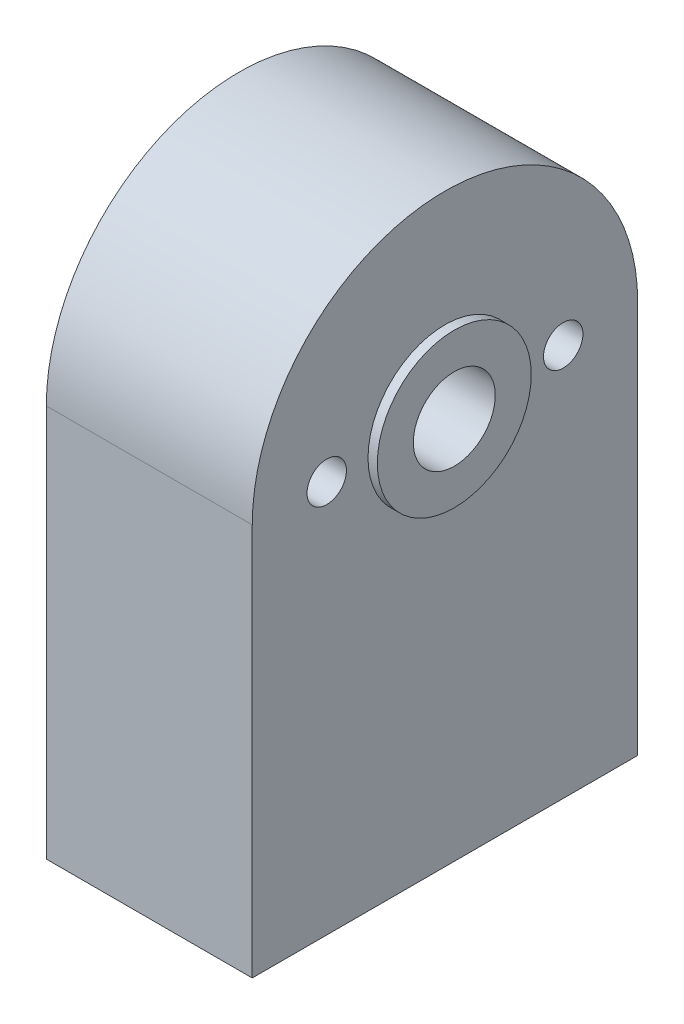
ISO-10303-21;
HEADER;
FILE_DESCRIPTION(('STEP AP214'),'2;1');
FILE_NAME('part.step','',(''),(''),'','','');
FILE_SCHEMA(('AUTOMOTIVE_DESIGN { 1 0 10303 214 1 1 1 1 }'));
ENDSEC;
DATA;
#1=APPLICATION_CONTEXT('core data for automotive mechanical design processes');
#2=APPLICATION_PROTOCOL_DEFINITION('international standard','automotive_design',2000,#1);
#3=PRODUCT_CONTEXT('',#1,'mechanical');
#4=PRODUCT('Part','Part','',(#3));
#5=PRODUCT_RELATED_PRODUCT_CATEGORY('part','',(#4));
#6=PRODUCT_DEFINITION_FORMATION('','',#4);
#7=PRODUCT_DEFINITION_CONTEXT('part definition',#1,'design');
#8=PRODUCT_DEFINITION('design','',#6,#7);
#9=PRODUCT_DEFINITION_SHAPE('','',#8);
#10=(LENGTH_UNIT() NAMED_UNIT(*) SI_UNIT(.MILLI.,.METRE.));
#11=(NAMED_UNIT(*) PLANE_ANGLE_UNIT() SI_UNIT($,.RADIAN.));
#12=(NAMED_UNIT(*) SI_UNIT($,.STERADIAN.) SOLID_ANGLE_UNIT());
#13=UNCERTAINTY_MEASURE_WITH_UNIT(LENGTH_MEASURE(1.E-05),#10,'distance_accuracy_value','');
#14=(GEOMETRIC_REPRESENTATION_CONTEXT(3) GLOBAL_UNCERTAINTY_ASSIGNED_CONTEXT((#13)) GLOBAL_UNIT_ASSIGNED_CONTEXT((#10,
#11,#12)) REPRESENTATION_CONTEXT('',''));
#15=CARTESIAN_POINT('',(0.,0.,0.));
#16=DIRECTION('',(0.,0.,1.));
#17=DIRECTION('',(1.,0.,0.));
#18=AXIS2_PLACEMENT_3D('',#15,#16,#17);
#19=CARTESIAN_POINT('',(16.59,-31.615,15.525));
#20=DIRECTION('',(0.,0.,-1.));
#21=DIRECTION('',(-1.,0.,0.));
#22=AXIS2_PLACEMENT_3D('',#19,#20,#21);
#23=PLANE('',#22);
#24=DIRECTION('',(0.,-1.,0.));
#25=VECTOR('',#24,1.);
#26=CARTESIAN_POINT('',(0.,-31.615,15.525));
#27=LINE('',#26,#25);
#28=CARTESIAN_POINT('',(0.,0.,15.525));
#29=VERTEX_POINT('',#28);
#30=CARTESIAN_POINT('',(0.,-31.615,15.525));
#31=VERTEX_POINT('',#30);
#32=EDGE_CURVE('E107',#29,#31,#27,.T.);
#33=ORIENTED_EDGE('',*,*,#32,.T.);
#34=DIRECTION('',(-1.,0.,0.));
#35=VECTOR('',#34,1.);
#36=CARTESIAN_POINT('',(16.59,-31.615,15.525));
#37=LINE('',#36,#35);
#38=CARTESIAN_POINT('',(16.59,-31.615,15.525));
#39=VERTEX_POINT('',#38);
#40=EDGE_CURVE('E49',#39,#31,#37,.T.);
#41=ORIENTED_EDGE('',*,*,#40,.F.);
#42=DIRECTION('',(0.,-1.,0.));
#43=VECTOR('',#42,1.);
#44=CARTESIAN_POINT('',(16.59,-31.615,15.525));
#45=LINE('',#44,#43);
#46=CARTESIAN_POINT('',(16.59,0.,15.525));
#47=VERTEX_POINT('',#46);
#48=EDGE_CURVE('E93',#47,#39,#45,.T.);
#49=ORIENTED_EDGE('',*,*,#48,.F.);
#50=DIRECTION('',(-1.,0.,0.));
#51=VECTOR('',#50,1.);
#52=CARTESIAN_POINT('',(16.59,0.,15.525));
#53=LINE('',#52,#51);
#54=EDGE_CURVE('E103',#47,#29,#53,.T.);
#55=ORIENTED_EDGE('',*,*,#54,.T.);
#56=EDGE_LOOP('',(#33,#41,#49,#55));
#57=FACE_BOUND('',#56,.T.);
#58=ADVANCED_FACE('F41',(#57),#23,.F.);
#59=CARTESIAN_POINT('',(16.59,-31.615,15.525));
#60=DIRECTION('',(0.,1.,0.));
#61=DIRECTION('',(0.,0.,1.));
#62=AXIS2_PLACEMENT_3D('',#59,#60,#61);
#63=PLANE('',#62);
#64=DIRECTION('',(0.,0.,-1.));
#65=VECTOR('',#64,1.);
#66=CARTESIAN_POINT('',(0.,-31.615,15.525));
#67=LINE('',#66,#65);
#68=CARTESIAN_POINT('',(0.,-31.615,-15.525));
#69=VERTEX_POINT('',#68);
#70=EDGE_CURVE('E98',#31,#69,#67,.T.);
#71=ORIENTED_EDGE('',*,*,#70,.T.);
#72=DIRECTION('',(-1.,0.,0.));
#73=VECTOR('',#72,1.);
#74=CARTESIAN_POINT('',(16.59,-31.615,-15.525));
#75=LINE('',#74,#73);
#76=CARTESIAN_POINT('',(16.59,-31.615,-15.525));
#77=VERTEX_POINT('',#76);
#78=EDGE_CURVE('E96',#77,#69,#75,.T.);
#79=ORIENTED_EDGE('',*,*,#78,.F.);
#80=DIRECTION('',(0.,0.,-1.));
#81=VECTOR('',#80,1.);
#82=CARTESIAN_POINT('',(16.59,-31.615,15.525));
#83=LINE('',#82,#81);
#84=EDGE_CURVE('E88',#39,#77,#83,.T.);
#85=ORIENTED_EDGE('',*,*,#84,.F.);
#86=ORIENTED_EDGE('',*,*,#40,.T.);
#87=EDGE_LOOP('',(#71,#79,#85,#86));
#88=FACE_BOUND('',#87,.T.);
#89=ADVANCED_FACE('F97',(#88),#63,.F.);
#90=CARTESIAN_POINT('',(16.59,-31.615,-15.525));
#91=DIRECTION('',(0.,0.,1.));
#92=DIRECTION('',(1.,0.,0.));
#93=AXIS2_PLACEMENT_3D('',#90,#91,#92);
#94=PLANE('',#93);
#95=DIRECTION('',(0.,1.,0.));
#96=VECTOR('',#95,1.);
#97=CARTESIAN_POINT('',(0.,-31.615,-15.525));
#98=LINE('',#97,#96);
#99=CARTESIAN_POINT('',(0.,0.,-15.525));
#100=VERTEX_POINT('',#99);
#101=EDGE_CURVE('E74',#69,#100,#98,.T.);
#102=ORIENTED_EDGE('',*,*,#101,.T.);
#103=DIRECTION('',(-1.,0.,0.));
#104=VECTOR('',#103,1.);
#105=CARTESIAN_POINT('',(16.59,0.,-15.525));
#106=LINE('',#105,#104);
#107=CARTESIAN_POINT('',(16.59,0.,-15.525));
#108=VERTEX_POINT('',#107);
#109=EDGE_CURVE('E99',#108,#100,#106,.T.);
#110=ORIENTED_EDGE('',*,*,#109,.F.);
#111=DIRECTION('',(0.,1.,0.));
#112=VECTOR('',#111,1.);
#113=CARTESIAN_POINT('',(16.59,-31.615,-15.525));
#114=LINE('',#113,#112);
#115=EDGE_CURVE('E91',#77,#108,#114,.T.);
#116=ORIENTED_EDGE('',*,*,#115,.F.);
#117=ORIENTED_EDGE('',*,*,#78,.T.);
#118=EDGE_LOOP('',(#102,#110,#116,#117));
#119=FACE_BOUND('',#118,.T.);
#120=ADVANCED_FACE('F101',(#119),#94,.F.);
#121=CARTESIAN_POINT('',(16.59,0.,0.));
#122=DIRECTION('',(-1.,0.,0.));
#123=DIRECTION('',(0.,0.,1.));
#124=AXIS2_PLACEMENT_3D('',#121,#122,#123);
#125=CYLINDRICAL_SURFACE('',#124,15.525);
#126=CARTESIAN_POINT('',(0.,0.,0.));
#127=DIRECTION('',(1.,0.,0.));
#128=DIRECTION('',(0.,0.,1.));
#129=AXIS2_PLACEMENT_3D('',#126,#127,#128);
#130=CIRCLE('',#129,15.525);
#131=EDGE_CURVE('E80',#100,#29,#130,.T.);
#132=ORIENTED_EDGE('',*,*,#131,.T.);
#133=ORIENTED_EDGE('',*,*,#54,.F.);
#134=CARTESIAN_POINT('',(16.59,0.,0.));
#135=DIRECTION('',(1.,0.,0.));
#136=DIRECTION('',(0.,0.,1.));
#137=AXIS2_PLACEMENT_3D('',#134,#135,#136);
#138=CIRCLE('',#137,15.525);
#139=EDGE_CURVE('E57',#108,#47,#138,.T.);
#140=ORIENTED_EDGE('',*,*,#139,.F.);
#141=ORIENTED_EDGE('',*,*,#109,.T.);
#142=EDGE_LOOP('',(#132,#133,#140,#141));
#143=FACE_BOUND('',#142,.T.);
#144=ADVANCED_FACE('F131',(#143),#125,.T.);
#145=CARTESIAN_POINT('',(16.59,0.,0.));
#146=DIRECTION('',(-1.,0.,0.));
#147=DIRECTION('',(0.,0.,1.));
#148=AXIS2_PLACEMENT_3D('',#145,#146,#147);
#149=PLANE('',#148);
#150=CARTESIAN_POINT('',(16.59,0.,-9.525));
#151=DIRECTION('',(-1.,0.,0.));
#152=DIRECTION('',(0.,0.,1.));
#153=AXIS2_PLACEMENT_3D('',#150,#151,#152);
#154=CIRCLE('',#153,1.5875);
#155=CARTESIAN_POINT('',(16.59,0.,-7.9375));
#156=VERTEX_POINT('',#155);
#157=EDGE_CURVE('E197',#156,#156,#154,.T.);
#158=ORIENTED_EDGE('',*,*,#157,.T.);
#159=EDGE_LOOP('',(#158));
#160=FACE_BOUND('',#159,.T.);
#161=CARTESIAN_POINT('',(16.59,0.,9.525));
#162=DIRECTION('',(-1.,0.,0.));
#163=DIRECTION('',(0.,0.,1.));
#164=AXIS2_PLACEMENT_3D('',#161,#162,#163);
#165=CIRCLE('',#164,1.5875);
#166=CARTESIAN_POINT('',(16.59,0.,11.1125));
#167=VERTEX_POINT('',#166);
#168=EDGE_CURVE('E198',#167,#167,#165,.T.);
#169=ORIENTED_EDGE('',*,*,#168,.T.);
#170=EDGE_LOOP('',(#169));
#171=FACE_BOUND('',#170,.T.);
#172=CARTESIAN_POINT('',(16.59,0.,0.));
#173=DIRECTION('',(-1.,0.,0.));
#174=DIRECTION('',(0.,0.,1.));
#175=AXIS2_PLACEMENT_3D('',#172,#173,#174);
#176=CIRCLE('',#175,6.2);
#177=CARTESIAN_POINT('',(16.59,0.,6.2));
#178=VERTEX_POINT('',#177);
#179=EDGE_CURVE('E11',#178,#178,#176,.F.);
#180=ORIENTED_EDGE('',*,*,#179,.F.);
#181=EDGE_LOOP('',(#180));
#182=FACE_BOUND('',#181,.T.);
#183=ORIENTED_EDGE('',*,*,#48,.T.);
#184=ORIENTED_EDGE('',*,*,#84,.T.);
#185=ORIENTED_EDGE('',*,*,#115,.T.);
#186=ORIENTED_EDGE('',*,*,#139,.T.);
#187=EDGE_LOOP('',(#183,#184,#185,#186));
#188=FACE_BOUND('',#187,.T.);
#189=ADVANCED_FACE('F89',(#160,#171,#182,#188),#149,.F.);
#190=CARTESIAN_POINT('',(0.,0.,0.));
#191=DIRECTION('',(-1.,0.,0.));
#192=DIRECTION('',(0.,0.,1.));
#193=AXIS2_PLACEMENT_3D('',#190,#191,#192);
#194=PLANE('',#193);
#195=CARTESIAN_POINT('',(0.,0.,-9.525));
#196=DIRECTION('',(1.,0.,0.));
#197=DIRECTION('',(0.,0.,-1.));
#198=AXIS2_PLACEMENT_3D('',#195,#196,#197);
#199=CIRCLE('',#198,1.5875);
#200=CARTESIAN_POINT('',(0.,0.,-11.1125));
#201=VERTEX_POINT('',#200);
#202=EDGE_CURVE('E194',#201,#201,#199,.T.);
#203=ORIENTED_EDGE('',*,*,#202,.T.);
#204=EDGE_LOOP('',(#203));
#205=FACE_BOUND('',#204,.T.);
#206=CARTESIAN_POINT('',(0.,0.,9.525));
#207=DIRECTION('',(1.,0.,0.));
#208=DIRECTION('',(0.,0.,-1.));
#209=AXIS2_PLACEMENT_3D('',#206,#207,#208);
#210=CIRCLE('',#209,1.5875);
#211=CARTESIAN_POINT('',(0.,0.,7.9375));
#212=VERTEX_POINT('',#211);
#213=EDGE_CURVE('E209',#212,#212,#210,.T.);
#214=ORIENTED_EDGE('',*,*,#213,.T.);
#215=EDGE_LOOP('',(#214));
#216=FACE_BOUND('',#215,.T.);
#217=CARTESIAN_POINT('',(0.,0.,0.));
#218=DIRECTION('',(1.,0.,0.));
#219=DIRECTION('',(0.,0.,-1.));
#220=AXIS2_PLACEMENT_3D('',#217,#218,#219);
#221=CIRCLE('',#220,3.3);
#222=CARTESIAN_POINT('',(0.,0.,-3.3));
#223=VERTEX_POINT('',#222);
#224=EDGE_CURVE('E203',#223,#223,#221,.T.);
#225=ORIENTED_EDGE('',*,*,#224,.T.);
#226=EDGE_LOOP('',(#225));
#227=FACE_BOUND('',#226,.T.);
#228=ORIENTED_EDGE('',*,*,#32,.F.);
#229=ORIENTED_EDGE('',*,*,#131,.F.);
#230=ORIENTED_EDGE('',*,*,#101,.F.);
#231=ORIENTED_EDGE('',*,*,#70,.F.);
#232=EDGE_LOOP('',(#228,#229,#230,#231));
#233=FACE_BOUND('',#232,.T.);
#234=ADVANCED_FACE('F118',(#205,#216,#227,#233),#194,.T.);
#235=CARTESIAN_POINT('',(17.34,0.,0.));
#236=DIRECTION('',(-1.,0.,0.));
#237=DIRECTION('',(0.,0.,1.));
#238=AXIS2_PLACEMENT_3D('',#235,#236,#237);
#239=CYLINDRICAL_SURFACE('',#238,6.2);
#240=CARTESIAN_POINT('',(17.34,0.,0.));
#241=DIRECTION('',(1.,0.,0.));
#242=DIRECTION('',(0.,0.,-1.));
#243=AXIS2_PLACEMENT_3D('',#240,#241,#242);
#244=CIRCLE('',#243,6.2);
#245=CARTESIAN_POINT('',(17.34,0.,-6.2));
#246=VERTEX_POINT('',#245);
#247=EDGE_CURVE('E110',#246,#246,#244,.T.);
#248=ORIENTED_EDGE('',*,*,#247,.F.);
#249=EDGE_LOOP('',(#248));
#250=FACE_BOUND('',#249,.T.);
#251=ORIENTED_EDGE('',*,*,#179,.T.);
#252=EDGE_LOOP('',(#251));
#253=FACE_BOUND('',#252,.T.);
#254=ADVANCED_FACE('F120',(#250,#253),#239,.T.);
#255=CARTESIAN_POINT('',(17.34,0.,0.));
#256=DIRECTION('',(1.,0.,0.));
#257=DIRECTION('',(0.,0.,-1.));
#258=AXIS2_PLACEMENT_3D('',#255,#256,#257);
#259=PLANE('',#258);
#260=CARTESIAN_POINT('',(17.34,0.,0.));
#261=DIRECTION('',(1.,0.,0.));
#262=DIRECTION('',(0.,0.,-1.));
#263=AXIS2_PLACEMENT_3D('',#260,#261,#262);
#264=CIRCLE('',#263,3.3);
#265=CARTESIAN_POINT('',(17.34,0.,-3.3));
#266=VERTEX_POINT('',#265);
#267=EDGE_CURVE('E206',#266,#266,#264,.T.);
#268=ORIENTED_EDGE('',*,*,#267,.F.);
#269=EDGE_LOOP('',(#268));
#270=FACE_BOUND('',#269,.T.);
#271=ORIENTED_EDGE('',*,*,#247,.T.);
#272=EDGE_LOOP('',(#271));
#273=FACE_BOUND('',#272,.T.);
#274=ADVANCED_FACE('F128',(#270,#273),#259,.T.);
#275=CARTESIAN_POINT('',(0.,0.,0.));
#276=DIRECTION('',(1.,0.,0.));
#277=DIRECTION('',(0.,0.,-1.));
#278=AXIS2_PLACEMENT_3D('',#275,#276,#277);
#279=CYLINDRICAL_SURFACE('',#278,3.3);
#280=ORIENTED_EDGE('',*,*,#224,.F.);
#281=EDGE_LOOP('',(#280));
#282=FACE_BOUND('',#281,.T.);
#283=ORIENTED_EDGE('',*,*,#267,.T.);
#284=EDGE_LOOP('',(#283));
#285=FACE_BOUND('',#284,.T.);
#286=ADVANCED_FACE('F166',(#282,#285),#279,.F.);
#287=CARTESIAN_POINT('',(0.,0.,9.525));
#288=DIRECTION('',(1.,0.,0.));
#289=DIRECTION('',(0.,0.,-1.));
#290=AXIS2_PLACEMENT_3D('',#287,#288,#289);
#291=CYLINDRICAL_SURFACE('',#290,1.5875);
#292=ORIENTED_EDGE('',*,*,#213,.F.);
#293=EDGE_LOOP('',(#292));
#294=FACE_BOUND('',#293,.T.);
#295=ORIENTED_EDGE('',*,*,#168,.F.);
#296=EDGE_LOOP('',(#295));
#297=FACE_BOUND('',#296,.T.);
#298=ADVANCED_FACE('F174',(#294,#297),#291,.F.);
#299=CARTESIAN_POINT('',(0.,0.,-9.525));
#300=DIRECTION('',(1.,0.,0.));
#301=DIRECTION('',(0.,0.,-1.));
#302=AXIS2_PLACEMENT_3D('',#299,#300,#301);
#303=CYLINDRICAL_SURFACE('',#302,1.5875);
#304=ORIENTED_EDGE('',*,*,#202,.F.);
#305=EDGE_LOOP('',(#304));
#306=FACE_BOUND('',#305,.T.);
#307=ORIENTED_EDGE('',*,*,#157,.F.);
#308=EDGE_LOOP('',(#307));
#309=FACE_BOUND('',#308,.T.);
#310=ADVANCED_FACE('F182',(#306,#309),#303,.F.);
#311=CLOSED_SHELL('',(#58,#89,#120,#144,#189,#234,#254,#274,#286,#298,#310));
#312=MANIFOLD_SOLID_BREP('B2',#311);
#313=ADVANCED_BREP_SHAPE_REPRESENTATION('',(#18,#312),#14);
#314=SHAPE_DEFINITION_REPRESENTATION(#9,#313);
ENDSEC;
END-ISO-10303-21;
